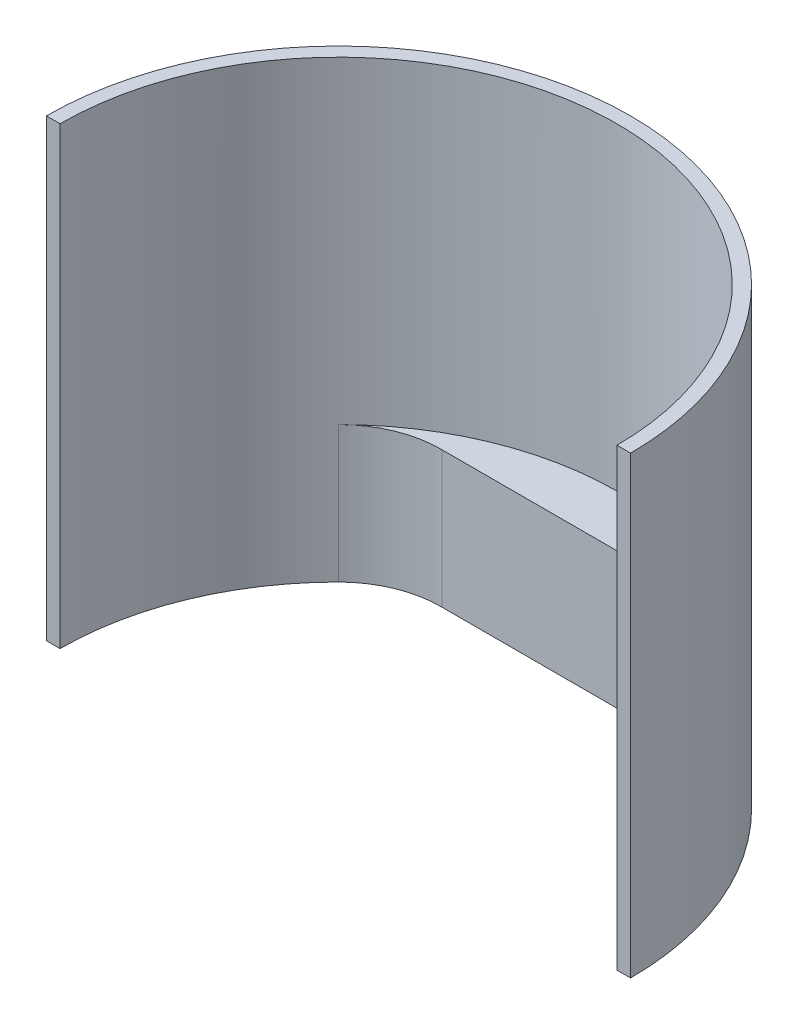
ISO-10303-21;
HEADER;
FILE_DESCRIPTION(('STEP AP214'),'2;1');
FILE_NAME('part.step','',(''),(''),'','','');
FILE_SCHEMA(('AUTOMOTIVE_DESIGN { 1 0 10303 214 1 1 1 1 }'));
ENDSEC;
DATA;
#1=APPLICATION_CONTEXT('core data for automotive mechanical design processes');
#2=APPLICATION_PROTOCOL_DEFINITION('international standard','automotive_design',2000,#1);
#3=PRODUCT_CONTEXT('',#1,'mechanical');
#4=PRODUCT('Part','Part','',(#3));
#5=PRODUCT_RELATED_PRODUCT_CATEGORY('part','',(#4));
#6=PRODUCT_DEFINITION_FORMATION('','',#4);
#7=PRODUCT_DEFINITION_CONTEXT('part definition',#1,'design');
#8=PRODUCT_DEFINITION('design','',#6,#7);
#9=PRODUCT_DEFINITION_SHAPE('','',#8);
#10=(LENGTH_UNIT() NAMED_UNIT(*) SI_UNIT(.MILLI.,.METRE.));
#11=(NAMED_UNIT(*) PLANE_ANGLE_UNIT() SI_UNIT($,.RADIAN.));
#12=(NAMED_UNIT(*) SI_UNIT($,.STERADIAN.) SOLID_ANGLE_UNIT());
#13=UNCERTAINTY_MEASURE_WITH_UNIT(LENGTH_MEASURE(1.E-05),#10,'distance_accuracy_value','');
#14=(GEOMETRIC_REPRESENTATION_CONTEXT(3) GLOBAL_UNCERTAINTY_ASSIGNED_CONTEXT((#13)) GLOBAL_UNIT_ASSIGNED_CONTEXT((#10,
#11,#12)) REPRESENTATION_CONTEXT('',''));
#15=CARTESIAN_POINT('',(0.,0.,0.));
#16=DIRECTION('',(0.,0.,1.));
#17=DIRECTION('',(1.,0.,0.));
#18=AXIS2_PLACEMENT_3D('',#15,#16,#17);
#19=CARTESIAN_POINT('',(0.,-60.,0.));
#20=DIRECTION('',(0.,1.,0.));
#21=DIRECTION('',(0.,0.,1.));
#22=AXIS2_PLACEMENT_3D('',#19,#20,#21);
#23=CYLINDRICAL_SURFACE('',#22,24.5);
#24=CARTESIAN_POINT('',(0.,12.,0.));
#25=DIRECTION('',(0.,1.,0.));
#26=DIRECTION('',(0.,0.,-1.));
#27=AXIS2_PLACEMENT_3D('',#24,#25,#26);
#28=CIRCLE('',#27,24.5);
#29=CARTESIAN_POINT('',(17.327213424372,12.,-17.3210182999229));
#30=VERTEX_POINT('',#29);
#31=CARTESIAN_POINT('',(-17.327213424372,12.,-17.3210182999229));
#32=VERTEX_POINT('',#31);
#33=EDGE_CURVE('E49',#30,#32,#28,.T.);
#34=ORIENTED_EDGE('',*,*,#33,.F.);
#35=DIRECTION('',(0.,1.,0.));
#36=VECTOR('',#35,1.);
#37=CARTESIAN_POINT('',(17.327213424372,-60.,-17.3210182999229));
#38=LINE('',#37,#36);
#39=CARTESIAN_POINT('',(17.3272134243719,0.,-17.3210182999229));
#40=VERTEX_POINT('',#39);
#41=EDGE_CURVE('E151',#30,#40,#38,.F.);
#42=ORIENTED_EDGE('',*,*,#41,.T.);
#43=CARTESIAN_POINT('',(0.,0.,0.));
#44=DIRECTION('',(0.,1.,0.));
#45=DIRECTION('',(0.,0.,1.));
#46=AXIS2_PLACEMENT_3D('',#43,#44,#45);
#47=CIRCLE('',#46,24.5);
#48=CARTESIAN_POINT('',(24.5,0.,0.));
#49=VERTEX_POINT('',#48);
#50=EDGE_CURVE('E141',#49,#40,#47,.T.);
#51=ORIENTED_EDGE('',*,*,#50,.F.);
#52=DIRECTION('',(0.,1.,0.));
#53=VECTOR('',#52,1.);
#54=CARTESIAN_POINT('',(24.5,-60.,0.));
#55=LINE('',#54,#53);
#56=CARTESIAN_POINT('',(24.5,40.,0.));
#57=VERTEX_POINT('',#56);
#58=EDGE_CURVE('E125',#49,#57,#55,.T.);
#59=ORIENTED_EDGE('',*,*,#58,.T.);
#60=CARTESIAN_POINT('',(0.,40.,0.));
#61=DIRECTION('',(0.,1.,0.));
#62=DIRECTION('',(0.,0.,1.));
#63=AXIS2_PLACEMENT_3D('',#60,#61,#62);
#64=CIRCLE('',#63,24.5);
#65=CARTESIAN_POINT('',(-24.5,40.,0.));
#66=VERTEX_POINT('',#65);
#67=EDGE_CURVE('E115',#57,#66,#64,.T.);
#68=ORIENTED_EDGE('',*,*,#67,.T.);
#69=DIRECTION('',(0.,1.,0.));
#70=VECTOR('',#69,1.);
#71=CARTESIAN_POINT('',(-24.5,-60.,0.));
#72=LINE('',#71,#70);
#73=CARTESIAN_POINT('',(-24.5,0.,0.));
#74=VERTEX_POINT('',#73);
#75=EDGE_CURVE('E132',#74,#66,#72,.T.);
#76=ORIENTED_EDGE('',*,*,#75,.F.);
#77=CARTESIAN_POINT('',(-17.3272134243644,0.,-17.3210182999305));
#78=VERTEX_POINT('',#77);
#79=EDGE_CURVE('E138',#78,#74,#47,.T.);
#80=ORIENTED_EDGE('',*,*,#79,.F.);
#81=DIRECTION('',(0.,1.,0.));
#82=VECTOR('',#81,1.);
#83=CARTESIAN_POINT('',(-17.327213424372,-60.,-17.3210182999229));
#84=LINE('',#83,#82);
#85=EDGE_CURVE('E149',#78,#32,#84,.T.);
#86=ORIENTED_EDGE('',*,*,#85,.T.);
#87=EDGE_LOOP('',(#34,#42,#51,#59,#68,#76,#80,#86));
#88=FACE_BOUND('',#87,.T.);
#89=ADVANCED_FACE('F34',(#88),#23,.F.);
#90=CARTESIAN_POINT('',(0.,40.,0.));
#91=DIRECTION('',(0.,-1.,0.));
#92=DIRECTION('',(0.,0.,-1.));
#93=AXIS2_PLACEMENT_3D('',#90,#91,#92);
#94=CYLINDRICAL_SURFACE('',#93,25.7);
#95=DIRECTION('',(0.,1.,0.));
#96=VECTOR('',#95,1.);
#97=CARTESIAN_POINT('',(25.7,-60.,0.));
#98=LINE('',#97,#96);
#99=CARTESIAN_POINT('',(25.7,0.,0.));
#100=VERTEX_POINT('',#99);
#101=CARTESIAN_POINT('',(25.7,40.,0.));
#102=VERTEX_POINT('',#101);
#103=EDGE_CURVE('E126',#100,#102,#98,.T.);
#104=ORIENTED_EDGE('',*,*,#103,.F.);
#105=CARTESIAN_POINT('',(0.,0.,0.));
#106=DIRECTION('',(0.,1.,0.));
#107=DIRECTION('',(0.,0.,1.));
#108=AXIS2_PLACEMENT_3D('',#105,#106,#107);
#109=CIRCLE('',#108,25.7);
#110=CARTESIAN_POINT('',(-25.7,0.,0.));
#111=VERTEX_POINT('',#110);
#112=EDGE_CURVE('E128',#100,#111,#109,.T.);
#113=ORIENTED_EDGE('',*,*,#112,.T.);
#114=DIRECTION('',(0.,1.,0.));
#115=VECTOR('',#114,1.);
#116=CARTESIAN_POINT('',(-25.7,-60.,0.));
#117=LINE('',#116,#115);
#118=CARTESIAN_POINT('',(-25.7,40.,0.));
#119=VERTEX_POINT('',#118);
#120=EDGE_CURVE('E129',#111,#119,#117,.T.);
#121=ORIENTED_EDGE('',*,*,#120,.T.);
#122=CARTESIAN_POINT('',(0.,40.,0.));
#123=DIRECTION('',(0.,1.,0.));
#124=DIRECTION('',(0.,0.,1.));
#125=AXIS2_PLACEMENT_3D('',#122,#123,#124);
#126=CIRCLE('',#125,25.7);
#127=EDGE_CURVE('E135',#102,#119,#126,.T.);
#128=ORIENTED_EDGE('',*,*,#127,.F.);
#129=EDGE_LOOP('',(#104,#113,#121,#128));
#130=FACE_BOUND('',#129,.T.);
#131=ADVANCED_FACE('F168',(#130),#94,.T.);
#132=CARTESIAN_POINT('',(0.,40.,0.));
#133=DIRECTION('',(0.,1.,0.));
#134=DIRECTION('',(0.,0.,1.));
#135=AXIS2_PLACEMENT_3D('',#132,#133,#134);
#136=PLANE('',#135);
#137=ORIENTED_EDGE('',*,*,#67,.F.);
#138=DIRECTION('',(1.,0.,0.));
#139=VECTOR('',#138,1.);
#140=CARTESIAN_POINT('',(0.,40.,0.));
#141=LINE('',#140,#139);
#142=EDGE_CURVE('E112',#57,#102,#141,.T.);
#143=ORIENTED_EDGE('',*,*,#142,.T.);
#144=ORIENTED_EDGE('',*,*,#127,.T.);
#145=DIRECTION('',(1.,0.,0.));
#146=VECTOR('',#145,1.);
#147=CARTESIAN_POINT('',(0.,40.,0.));
#148=LINE('',#147,#146);
#149=EDGE_CURVE('E122',#119,#66,#148,.T.);
#150=ORIENTED_EDGE('',*,*,#149,.T.);
#151=EDGE_LOOP('',(#137,#143,#144,#150));
#152=FACE_BOUND('',#151,.T.);
#153=ADVANCED_FACE('F175',(#152),#136,.T.);
#154=CARTESIAN_POINT('',(0.,0.,0.));
#155=DIRECTION('',(0.,1.,0.));
#156=DIRECTION('',(0.,0.,1.));
#157=AXIS2_PLACEMENT_3D('',#154,#155,#156);
#158=PLANE('',#157);
#159=DIRECTION('',(1.,0.,0.));
#160=VECTOR('',#159,1.);
#161=CARTESIAN_POINT('',(0.,0.,0.));
#162=LINE('',#161,#160);
#163=EDGE_CURVE('E147',#49,#100,#162,.T.);
#164=ORIENTED_EDGE('',*,*,#163,.F.);
#165=ORIENTED_EDGE('',*,*,#50,.T.);
#166=CARTESIAN_POINT('',(10.962114615419,0.,-10.9581952509716));
#167=DIRECTION('',(0.,1.,0.));
#168=DIRECTION('',(0.,0.,1.));
#169=AXIS2_PLACEMENT_3D('',#166,#167,#168);
#170=CIRCLE('',#169,9.);
#171=CARTESIAN_POINT('',(10.8678129506406,0.,-19.9577011927453));
#172=VERTEX_POINT('',#171);
#173=EDGE_CURVE('E153',#40,#172,#170,.T.);
#174=ORIENTED_EDGE('',*,*,#173,.T.);
#175=DIRECTION('',(1.,0.,0.));
#176=VECTOR('',#175,1.);
#177=CARTESIAN_POINT('',(-10.8678129506406,0.,-19.9577011927453));
#178=LINE('',#177,#176);
#179=CARTESIAN_POINT('',(-10.8678129506406,0.,-19.9577011927453));
#180=VERTEX_POINT('',#179);
#181=EDGE_CURVE('E109',#180,#172,#178,.T.);
#182=ORIENTED_EDGE('',*,*,#181,.F.);
#183=CARTESIAN_POINT('',(-10.962114615419,0.,-10.9581952509716));
#184=DIRECTION('',(0.,1.,0.));
#185=DIRECTION('',(0.,0.,1.));
#186=AXIS2_PLACEMENT_3D('',#183,#184,#185);
#187=CIRCLE('',#186,9.);
#188=EDGE_CURVE('E42',#180,#78,#187,.T.);
#189=ORIENTED_EDGE('',*,*,#188,.T.);
#190=ORIENTED_EDGE('',*,*,#79,.T.);
#191=DIRECTION('',(1.,0.,0.));
#192=VECTOR('',#191,1.);
#193=CARTESIAN_POINT('',(0.,0.,0.));
#194=LINE('',#193,#192);
#195=EDGE_CURVE('E144',#111,#74,#194,.T.);
#196=ORIENTED_EDGE('',*,*,#195,.F.);
#197=ORIENTED_EDGE('',*,*,#112,.F.);
#198=EDGE_LOOP('',(#164,#165,#174,#182,#189,#190,#196,#197));
#199=FACE_BOUND('',#198,.T.);
#200=ADVANCED_FACE('F159',(#199),#158,.F.);
#201=CARTESIAN_POINT('',(0.,-60.,0.));
#202=DIRECTION('',(0.,0.,1.));
#203=DIRECTION('',(1.,0.,0.));
#204=AXIS2_PLACEMENT_3D('',#201,#202,#203);
#205=PLANE('',#204);
#206=ORIENTED_EDGE('',*,*,#163,.T.);
#207=ORIENTED_EDGE('',*,*,#103,.T.);
#208=ORIENTED_EDGE('',*,*,#142,.F.);
#209=ORIENTED_EDGE('',*,*,#58,.F.);
#210=EDGE_LOOP('',(#206,#207,#208,#209));
#211=FACE_BOUND('',#210,.T.);
#212=ADVANCED_FACE('F172',(#211),#205,.T.);
#213=CARTESIAN_POINT('',(0.,-60.,0.));
#214=DIRECTION('',(0.,0.,1.));
#215=DIRECTION('',(1.,0.,0.));
#216=AXIS2_PLACEMENT_3D('',#213,#214,#215);
#217=PLANE('',#216);
#218=ORIENTED_EDGE('',*,*,#195,.T.);
#219=ORIENTED_EDGE('',*,*,#75,.T.);
#220=ORIENTED_EDGE('',*,*,#149,.F.);
#221=ORIENTED_EDGE('',*,*,#120,.F.);
#222=EDGE_LOOP('',(#218,#219,#220,#221));
#223=FACE_BOUND('',#222,.T.);
#224=ADVANCED_FACE('F164',(#223),#217,.T.);
#225=CARTESIAN_POINT('',(-10.8678129506406,12.,-19.9577011927453));
#226=DIRECTION('',(0.,0.,-1.));
#227=DIRECTION('',(-1.,0.,0.));
#228=AXIS2_PLACEMENT_3D('',#225,#226,#227);
#229=PLANE('',#228);
#230=ORIENTED_EDGE('',*,*,#181,.T.);
#231=DIRECTION('',(0.,-1.,0.));
#232=VECTOR('',#231,1.);
#233=CARTESIAN_POINT('',(10.8678129506406,12.,-19.9577011927453));
#234=LINE('',#233,#232);
#235=CARTESIAN_POINT('',(10.8678129506406,12.,-19.9577011927453));
#236=VERTEX_POINT('',#235);
#237=EDGE_CURVE('E107',#236,#172,#234,.T.);
#238=ORIENTED_EDGE('',*,*,#237,.F.);
#239=DIRECTION('',(1.,0.,0.));
#240=VECTOR('',#239,1.);
#241=CARTESIAN_POINT('',(-10.8678129506406,12.,-19.9577011927453));
#242=LINE('',#241,#240);
#243=CARTESIAN_POINT('',(-10.8678129506406,12.,-19.9577011927453));
#244=VERTEX_POINT('',#243);
#245=EDGE_CURVE('E96',#244,#236,#242,.T.);
#246=ORIENTED_EDGE('',*,*,#245,.F.);
#247=DIRECTION('',(0.,-1.,0.));
#248=VECTOR('',#247,1.);
#249=CARTESIAN_POINT('',(-10.8678129506406,12.,-19.9577011927453));
#250=LINE('',#249,#248);
#251=EDGE_CURVE('E105',#244,#180,#250,.T.);
#252=ORIENTED_EDGE('',*,*,#251,.T.);
#253=EDGE_LOOP('',(#230,#238,#246,#252));
#254=FACE_BOUND('',#253,.T.);
#255=ADVANCED_FACE('F104',(#254),#229,.F.);
#256=CARTESIAN_POINT('',(0.,12.,0.));
#257=DIRECTION('',(0.,-1.,0.));
#258=DIRECTION('',(0.,0.,-1.));
#259=AXIS2_PLACEMENT_3D('',#256,#257,#258);
#260=PLANE('',#259);
#261=ORIENTED_EDGE('',*,*,#33,.T.);
#262=CARTESIAN_POINT('',(-10.962114615419,12.,-10.9581952509716));
#263=DIRECTION('',(0.,-1.,0.));
#264=DIRECTION('',(0.,0.,-1.));
#265=AXIS2_PLACEMENT_3D('',#262,#263,#264);
#266=CIRCLE('',#265,9.);
#267=EDGE_CURVE('E11',#32,#244,#266,.T.);
#268=ORIENTED_EDGE('',*,*,#267,.T.);
#269=ORIENTED_EDGE('',*,*,#245,.T.);
#270=CARTESIAN_POINT('',(10.962114615419,12.,-10.9581952509716));
#271=DIRECTION('',(0.,-1.,0.));
#272=DIRECTION('',(0.,0.,-1.));
#273=AXIS2_PLACEMENT_3D('',#270,#271,#272);
#274=CIRCLE('',#273,9.);
#275=EDGE_CURVE('E155',#236,#30,#274,.T.);
#276=ORIENTED_EDGE('',*,*,#275,.T.);
#277=EDGE_LOOP('',(#261,#268,#269,#276));
#278=FACE_BOUND('',#277,.T.);
#279=ADVANCED_FACE('F95',(#278),#260,.F.);
#280=CARTESIAN_POINT('',(10.962114615419,12.,-10.9581952509716));
#281=DIRECTION('',(0.,-1.,0.));
#282=DIRECTION('',(0.,0.,-1.));
#283=AXIS2_PLACEMENT_3D('',#280,#281,#282);
#284=CYLINDRICAL_SURFACE('',#283,9.);
#285=ORIENTED_EDGE('',*,*,#275,.F.);
#286=ORIENTED_EDGE('',*,*,#237,.T.);
#287=ORIENTED_EDGE('',*,*,#173,.F.);
#288=ORIENTED_EDGE('',*,*,#41,.F.);
#289=EDGE_LOOP('',(#285,#286,#287,#288));
#290=FACE_BOUND('',#289,.T.);
#291=ADVANCED_FACE('F201',(#290),#284,.F.);
#292=CARTESIAN_POINT('',(-10.962114615419,-60.,-10.9581952509716));
#293=DIRECTION('',(0.,-1.,0.));
#294=DIRECTION('',(0.,0.,-1.));
#295=AXIS2_PLACEMENT_3D('',#292,#293,#294);
#296=CYLINDRICAL_SURFACE('',#295,9.);
#297=ORIENTED_EDGE('',*,*,#267,.F.);
#298=ORIENTED_EDGE('',*,*,#85,.F.);
#299=ORIENTED_EDGE('',*,*,#188,.F.);
#300=ORIENTED_EDGE('',*,*,#251,.F.);
#301=EDGE_LOOP('',(#297,#298,#299,#300));
#302=FACE_BOUND('',#301,.T.);
#303=ADVANCED_FACE('F36',(#302),#296,.F.);
#304=CLOSED_SHELL('',(#89,#131,#153,#200,#212,#224,#255,#279,#291,#303));
#305=MANIFOLD_SOLID_BREP('B2',#304);
#306=ADVANCED_BREP_SHAPE_REPRESENTATION('',(#18,#305),#14);
#307=SHAPE_DEFINITION_REPRESENTATION(#9,#306);
ENDSEC;
END-ISO-10303-21;
